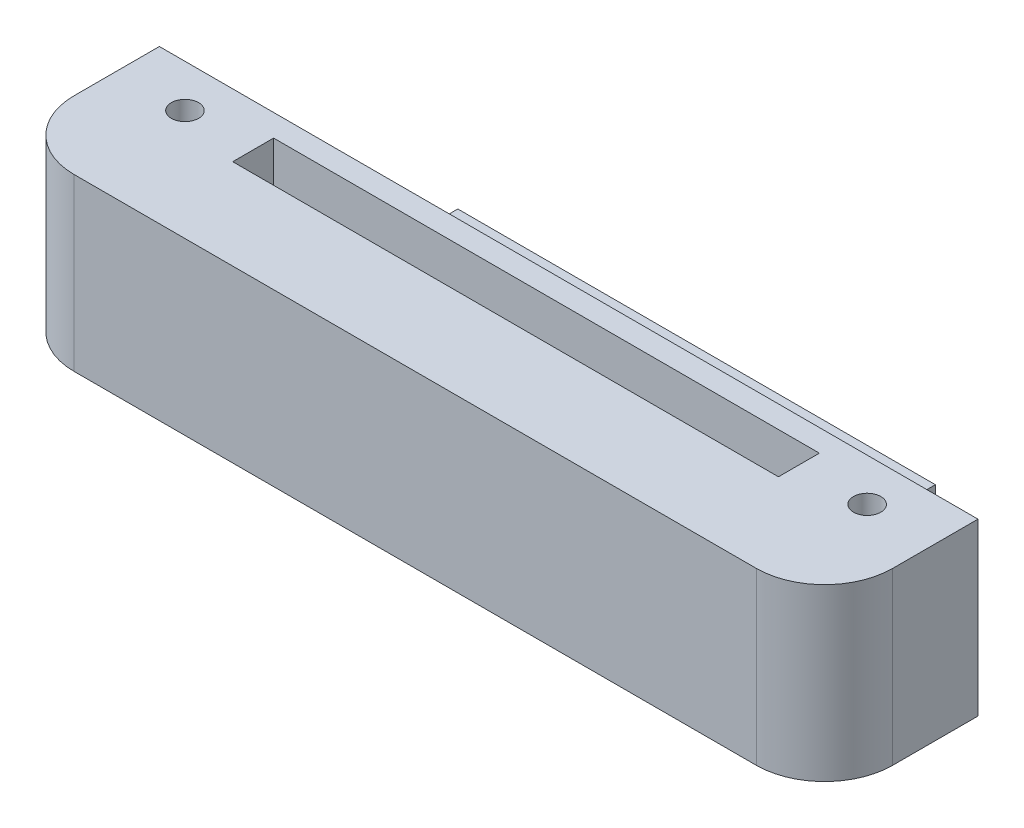
ISO-10303-21;
HEADER;
FILE_DESCRIPTION(('STEP AP214'),'2;1');
FILE_NAME('part.step','',(''),(''),'','','');
FILE_SCHEMA(('AUTOMOTIVE_DESIGN { 1 0 10303 214 1 1 1 1 }'));
ENDSEC;
DATA;
#1=APPLICATION_CONTEXT('core data for automotive mechanical design processes');
#2=APPLICATION_PROTOCOL_DEFINITION('international standard','automotive_design',2000,#1);
#3=PRODUCT_CONTEXT('',#1,'mechanical');
#4=PRODUCT('Part','Part','',(#3));
#5=PRODUCT_RELATED_PRODUCT_CATEGORY('part','',(#4));
#6=PRODUCT_DEFINITION_FORMATION('','',#4);
#7=PRODUCT_DEFINITION_CONTEXT('part definition',#1,'design');
#8=PRODUCT_DEFINITION('design','',#6,#7);
#9=PRODUCT_DEFINITION_SHAPE('','',#8);
#10=(LENGTH_UNIT() NAMED_UNIT(*) SI_UNIT(.MILLI.,.METRE.));
#11=(NAMED_UNIT(*) PLANE_ANGLE_UNIT() SI_UNIT($,.RADIAN.));
#12=(NAMED_UNIT(*) SI_UNIT($,.STERADIAN.) SOLID_ANGLE_UNIT());
#13=UNCERTAINTY_MEASURE_WITH_UNIT(LENGTH_MEASURE(1.E-05),#10,'distance_accuracy_value','');
#14=(GEOMETRIC_REPRESENTATION_CONTEXT(3) GLOBAL_UNCERTAINTY_ASSIGNED_CONTEXT((#13)) GLOBAL_UNIT_ASSIGNED_CONTEXT((#10,
#11,#12)) REPRESENTATION_CONTEXT('',''));
#15=CARTESIAN_POINT('',(0.,0.,0.));
#16=DIRECTION('',(0.,0.,1.));
#17=DIRECTION('',(1.,0.,0.));
#18=AXIS2_PLACEMENT_3D('',#15,#16,#17);
#19=CARTESIAN_POINT('',(60.,25.,15.625));
#20=DIRECTION('',(-1.,0.,0.));
#21=DIRECTION('',(0.,0.,1.));
#22=AXIS2_PLACEMENT_3D('',#19,#20,#21);
#23=PLANE('',#22);
#24=DIRECTION('',(0.,0.,-1.));
#25=VECTOR('',#24,1.);
#26=CARTESIAN_POINT('',(60.,0.,15.625));
#27=LINE('',#26,#25);
#28=CARTESIAN_POINT('',(60.,0.,15.625));
#29=VERTEX_POINT('',#28);
#30=CARTESIAN_POINT('',(60.,0.,3.12499999999999));
#31=VERTEX_POINT('',#30);
#32=EDGE_CURVE('E160',#29,#31,#27,.T.);
#33=ORIENTED_EDGE('',*,*,#32,.T.);
#34=DIRECTION('',(0.,-1.,0.));
#35=VECTOR('',#34,1.);
#36=CARTESIAN_POINT('',(60.,25.,3.125));
#37=LINE('',#36,#35);
#38=CARTESIAN_POINT('',(60.,25.,3.125));
#39=VERTEX_POINT('',#38);
#40=EDGE_CURVE('E218',#39,#31,#37,.T.);
#41=ORIENTED_EDGE('',*,*,#40,.F.);
#42=DIRECTION('',(0.,0.,-1.));
#43=VECTOR('',#42,1.);
#44=CARTESIAN_POINT('',(60.,25.,15.625));
#45=LINE('',#44,#43);
#46=CARTESIAN_POINT('',(60.,25.,15.625));
#47=VERTEX_POINT('',#46);
#48=EDGE_CURVE('E167',#47,#39,#45,.T.);
#49=ORIENTED_EDGE('',*,*,#48,.F.);
#50=DIRECTION('',(0.,1.,0.));
#51=VECTOR('',#50,1.);
#52=CARTESIAN_POINT('',(60.,25.,15.625));
#53=LINE('',#52,#51);
#54=EDGE_CURVE('E188',#47,#29,#53,.F.);
#55=ORIENTED_EDGE('',*,*,#54,.T.);
#56=EDGE_LOOP('',(#33,#41,#49,#55));
#57=FACE_BOUND('',#56,.T.);
#58=ADVANCED_FACE('F35',(#57),#23,.F.);
#59=CARTESIAN_POINT('',(-60.,25.,-15.625));
#60=DIRECTION('',(0.,0.,1.));
#61=DIRECTION('',(1.,0.,0.));
#62=AXIS2_PLACEMENT_3D('',#59,#60,#61);
#63=PLANE('',#62);
#64=DIRECTION('',(-1.,0.,0.));
#65=VECTOR('',#64,1.);
#66=CARTESIAN_POINT('',(-60.,0.,-15.625));
#67=LINE('',#66,#65);
#68=CARTESIAN_POINT('',(35.,0.,-15.625));
#69=VERTEX_POINT('',#68);
#70=CARTESIAN_POINT('',(-35.,0.,-15.625));
#71=VERTEX_POINT('',#70);
#72=EDGE_CURVE('E175',#69,#71,#67,.T.);
#73=ORIENTED_EDGE('',*,*,#72,.T.);
#74=DIRECTION('',(0.,1.,0.));
#75=VECTOR('',#74,1.);
#76=CARTESIAN_POINT('',(-35.,-17.5,-15.625));
#77=LINE('',#76,#75);
#78=CARTESIAN_POINT('',(-35.,7.5,-15.625));
#79=VERTEX_POINT('',#78);
#80=EDGE_CURVE('E146',#71,#79,#77,.T.);
#81=ORIENTED_EDGE('',*,*,#80,.T.);
#82=DIRECTION('',(1.,0.,0.));
#83=VECTOR('',#82,1.);
#84=CARTESIAN_POINT('',(-60.,7.5,-15.625));
#85=LINE('',#84,#83);
#86=CARTESIAN_POINT('',(35.,7.5,-15.625));
#87=VERTEX_POINT('',#86);
#88=EDGE_CURVE('E154',#79,#87,#85,.T.);
#89=ORIENTED_EDGE('',*,*,#88,.T.);
#90=DIRECTION('',(0.,1.,0.));
#91=VECTOR('',#90,1.);
#92=CARTESIAN_POINT('',(35.,-17.5,-15.625));
#93=LINE('',#92,#91);
#94=EDGE_CURVE('E272',#69,#87,#93,.T.);
#95=ORIENTED_EDGE('',*,*,#94,.F.);
#96=EDGE_LOOP('',(#73,#81,#89,#95));
#97=FACE_BOUND('',#96,.T.);
#98=ADVANCED_FACE('F277',(#97),#63,.F.);
#99=CARTESIAN_POINT('',(-60.,25.,15.625));
#100=DIRECTION('',(1.,0.,0.));
#101=DIRECTION('',(0.,0.,-1.));
#102=AXIS2_PLACEMENT_3D('',#99,#100,#101);
#103=PLANE('',#102);
#104=DIRECTION('',(0.,-1.,0.));
#105=VECTOR('',#104,1.);
#106=CARTESIAN_POINT('',(-60.,25.,3.125));
#107=LINE('',#106,#105);
#108=CARTESIAN_POINT('',(-60.,25.,3.125));
#109=VERTEX_POINT('',#108);
#110=CARTESIAN_POINT('',(-60.,0.,3.12499999999999));
#111=VERTEX_POINT('',#110);
#112=EDGE_CURVE('E163',#109,#111,#107,.T.);
#113=ORIENTED_EDGE('',*,*,#112,.T.);
#114=DIRECTION('',(0.,0.,1.));
#115=VECTOR('',#114,1.);
#116=CARTESIAN_POINT('',(-60.,0.,15.625));
#117=LINE('',#116,#115);
#118=CARTESIAN_POINT('',(-60.,0.,15.625));
#119=VERTEX_POINT('',#118);
#120=EDGE_CURVE('E57',#111,#119,#117,.T.);
#121=ORIENTED_EDGE('',*,*,#120,.T.);
#122=DIRECTION('',(0.,-1.,0.));
#123=VECTOR('',#122,1.);
#124=CARTESIAN_POINT('',(-60.,25.,15.625));
#125=LINE('',#124,#123);
#126=CARTESIAN_POINT('',(-60.,25.,15.625));
#127=VERTEX_POINT('',#126);
#128=EDGE_CURVE('E11',#119,#127,#125,.F.);
#129=ORIENTED_EDGE('',*,*,#128,.T.);
#130=DIRECTION('',(0.,0.,1.));
#131=VECTOR('',#130,1.);
#132=CARTESIAN_POINT('',(-60.,25.,15.625));
#133=LINE('',#132,#131);
#134=EDGE_CURVE('E169',#109,#127,#133,.T.);
#135=ORIENTED_EDGE('',*,*,#134,.F.);
#136=EDGE_LOOP('',(#113,#121,#129,#135));
#137=FACE_BOUND('',#136,.T.);
#138=ADVANCED_FACE('F283',(#137),#103,.F.);
#139=CARTESIAN_POINT('',(0.,25.,0.));
#140=DIRECTION('',(0.,-1.,0.));
#141=DIRECTION('',(0.,0.,-1.));
#142=AXIS2_PLACEMENT_3D('',#139,#140,#141);
#143=PLANE('',#142);
#144=DIRECTION('',(-1.,0.,0.));
#145=VECTOR('',#144,1.);
#146=CARTESIAN_POINT('',(-40.,25.,6.375));
#147=LINE('',#146,#145);
#148=CARTESIAN_POINT('',(40.,25.,6.375));
#149=VERTEX_POINT('',#148);
#150=CARTESIAN_POINT('',(-40.,25.,6.375));
#151=VERTEX_POINT('',#150);
#152=EDGE_CURVE('E250',#149,#151,#147,.T.);
#153=ORIENTED_EDGE('',*,*,#152,.F.);
#154=DIRECTION('',(0.,0.,-1.));
#155=VECTOR('',#154,1.);
#156=CARTESIAN_POINT('',(40.,25.,12.375));
#157=LINE('',#156,#155);
#158=CARTESIAN_POINT('',(40.,25.,12.375));
#159=VERTEX_POINT('',#158);
#160=EDGE_CURVE('E253',#159,#149,#157,.T.);
#161=ORIENTED_EDGE('',*,*,#160,.F.);
#162=DIRECTION('',(1.,0.,0.));
#163=VECTOR('',#162,1.);
#164=CARTESIAN_POINT('',(-40.,25.,12.375));
#165=LINE('',#164,#163);
#166=CARTESIAN_POINT('',(-40.,25.,12.375));
#167=VERTEX_POINT('',#166);
#168=EDGE_CURVE('E243',#167,#159,#165,.T.);
#169=ORIENTED_EDGE('',*,*,#168,.F.);
#170=DIRECTION('',(0.,0.,1.));
#171=VECTOR('',#170,1.);
#172=CARTESIAN_POINT('',(-40.,25.,12.375));
#173=LINE('',#172,#171);
#174=EDGE_CURVE('E247',#151,#167,#173,.T.);
#175=ORIENTED_EDGE('',*,*,#174,.F.);
#176=EDGE_LOOP('',(#153,#161,#169,#175));
#177=FACE_BOUND('',#176,.T.);
#178=CARTESIAN_POINT('',(50.,25.,9.37499999999999));
#179=DIRECTION('',(0.,1.,0.));
#180=DIRECTION('',(0.,0.,1.));
#181=AXIS2_PLACEMENT_3D('',#178,#179,#180);
#182=CIRCLE('',#181,1.99999999999999);
#183=CARTESIAN_POINT('',(50.,25.,11.375));
#184=VERTEX_POINT('',#183);
#185=EDGE_CURVE('E230',#184,#184,#182,.T.);
#186=ORIENTED_EDGE('',*,*,#185,.F.);
#187=EDGE_LOOP('',(#186));
#188=FACE_BOUND('',#187,.T.);
#189=CARTESIAN_POINT('',(-50.,25.,9.375));
#190=DIRECTION('',(0.,1.,0.));
#191=DIRECTION('',(0.,0.,1.));
#192=AXIS2_PLACEMENT_3D('',#189,#190,#191);
#193=CIRCLE('',#192,1.99999999999999);
#194=CARTESIAN_POINT('',(-50.,25.,11.375));
#195=VERTEX_POINT('',#194);
#196=EDGE_CURVE('E222',#195,#195,#193,.T.);
#197=ORIENTED_EDGE('',*,*,#196,.F.);
#198=EDGE_LOOP('',(#197));
#199=FACE_BOUND('',#198,.T.);
#200=DIRECTION('',(-1.,0.,0.));
#201=VECTOR('',#200,1.);
#202=CARTESIAN_POINT('',(-60.,25.,25.625));
#203=LINE('',#202,#201);
#204=CARTESIAN_POINT('',(50.,25.,25.625));
#205=VERTEX_POINT('',#204);
#206=CARTESIAN_POINT('',(-50.,25.,25.625));
#207=VERTEX_POINT('',#206);
#208=EDGE_CURVE('E208',#205,#207,#203,.T.);
#209=ORIENTED_EDGE('',*,*,#208,.F.);
#210=CARTESIAN_POINT('',(50.,25.,15.625));
#211=DIRECTION('',(0.,-1.,0.));
#212=DIRECTION('',(0.,0.,-1.));
#213=AXIS2_PLACEMENT_3D('',#210,#211,#212);
#214=CIRCLE('',#213,10.);
#215=EDGE_CURVE('E186',#205,#47,#214,.F.);
#216=ORIENTED_EDGE('',*,*,#215,.T.);
#217=ORIENTED_EDGE('',*,*,#48,.T.);
#218=DIRECTION('',(1.,0.,0.));
#219=VECTOR('',#218,1.);
#220=CARTESIAN_POINT('',(-60.,25.,3.125));
#221=LINE('',#220,#219);
#222=EDGE_CURVE('E158',#109,#39,#221,.T.);
#223=ORIENTED_EDGE('',*,*,#222,.F.);
#224=ORIENTED_EDGE('',*,*,#134,.T.);
#225=CARTESIAN_POINT('',(-50.,25.,15.625));
#226=DIRECTION('',(0.,-1.,0.));
#227=DIRECTION('',(0.,0.,-1.));
#228=AXIS2_PLACEMENT_3D('',#225,#226,#227);
#229=CIRCLE('',#228,10.);
#230=EDGE_CURVE('E184',#127,#207,#229,.F.);
#231=ORIENTED_EDGE('',*,*,#230,.T.);
#232=EDGE_LOOP('',(#209,#216,#217,#223,#224,#231));
#233=FACE_BOUND('',#232,.T.);
#234=ADVANCED_FACE('F214',(#177,#188,#199,#233),#143,.F.);
#235=CARTESIAN_POINT('',(0.,0.,0.));
#236=DIRECTION('',(0.,-1.,0.));
#237=DIRECTION('',(0.,0.,-1.));
#238=AXIS2_PLACEMENT_3D('',#235,#236,#237);
#239=PLANE('',#238);
#240=DIRECTION('',(0.,0.,1.));
#241=VECTOR('',#240,1.);
#242=CARTESIAN_POINT('',(-35.,0.,0.));
#243=LINE('',#242,#241);
#244=CARTESIAN_POINT('',(-35.,0.,3.12499999999999));
#245=VERTEX_POINT('',#244);
#246=EDGE_CURVE('E141',#71,#245,#243,.T.);
#247=ORIENTED_EDGE('',*,*,#246,.F.);
#248=ORIENTED_EDGE('',*,*,#72,.F.);
#249=DIRECTION('',(0.,0.,-1.));
#250=VECTOR('',#249,1.);
#251=CARTESIAN_POINT('',(35.,0.,0.));
#252=LINE('',#251,#250);
#253=CARTESIAN_POINT('',(35.,0.,3.12499999999999));
#254=VERTEX_POINT('',#253);
#255=EDGE_CURVE('E270',#254,#69,#252,.T.);
#256=ORIENTED_EDGE('',*,*,#255,.F.);
#257=DIRECTION('',(-1.,0.,0.));
#258=VECTOR('',#257,1.);
#259=CARTESIAN_POINT('',(0.,0.,3.12499999999999));
#260=LINE('',#259,#258);
#261=EDGE_CURVE('E268',#31,#254,#260,.T.);
#262=ORIENTED_EDGE('',*,*,#261,.F.);
#263=ORIENTED_EDGE('',*,*,#32,.F.);
#264=CARTESIAN_POINT('',(50.,0.,15.625));
#265=DIRECTION('',(0.,-1.,0.));
#266=DIRECTION('',(0.,0.,-1.));
#267=AXIS2_PLACEMENT_3D('',#264,#265,#266);
#268=CIRCLE('',#267,10.);
#269=CARTESIAN_POINT('',(50.,0.,25.625));
#270=VERTEX_POINT('',#269);
#271=EDGE_CURVE('E43',#29,#270,#268,.T.);
#272=ORIENTED_EDGE('',*,*,#271,.T.);
#273=DIRECTION('',(1.,0.,0.));
#274=VECTOR('',#273,1.);
#275=CARTESIAN_POINT('',(-60.,0.,25.625));
#276=LINE('',#275,#274);
#277=CARTESIAN_POINT('',(-50.,0.,25.625));
#278=VERTEX_POINT('',#277);
#279=EDGE_CURVE('E198',#278,#270,#276,.T.);
#280=ORIENTED_EDGE('',*,*,#279,.F.);
#281=CARTESIAN_POINT('',(-50.,0.,15.625));
#282=DIRECTION('',(0.,-1.,0.));
#283=DIRECTION('',(0.,0.,-1.));
#284=AXIS2_PLACEMENT_3D('',#281,#282,#283);
#285=CIRCLE('',#284,10.);
#286=EDGE_CURVE('E190',#278,#119,#285,.T.);
#287=ORIENTED_EDGE('',*,*,#286,.T.);
#288=ORIENTED_EDGE('',*,*,#120,.F.);
#289=DIRECTION('',(-1.,0.,0.));
#290=VECTOR('',#289,1.);
#291=CARTESIAN_POINT('',(0.,0.,3.12499999999999));
#292=LINE('',#291,#290);
#293=EDGE_CURVE('E266',#245,#111,#292,.T.);
#294=ORIENTED_EDGE('',*,*,#293,.F.);
#295=EDGE_LOOP('',(#247,#248,#256,#262,#263,#272,#280,#287,#288,#294));
#296=FACE_BOUND('',#295,.T.);
#297=CARTESIAN_POINT('',(50.,0.,9.37499999999999));
#298=DIRECTION('',(0.,1.,0.));
#299=DIRECTION('',(0.,0.,1.));
#300=AXIS2_PLACEMENT_3D('',#297,#298,#299);
#301=CIRCLE('',#300,1.99999999999999);
#302=CARTESIAN_POINT('',(50.,0.,11.375));
#303=VERTEX_POINT('',#302);
#304=EDGE_CURVE('E227',#303,#303,#301,.T.);
#305=ORIENTED_EDGE('',*,*,#304,.T.);
#306=EDGE_LOOP('',(#305));
#307=FACE_BOUND('',#306,.T.);
#308=CARTESIAN_POINT('',(-50.,0.,9.375));
#309=DIRECTION('',(0.,1.,0.));
#310=DIRECTION('',(0.,0.,1.));
#311=AXIS2_PLACEMENT_3D('',#308,#309,#310);
#312=CIRCLE('',#311,1.99999999999999);
#313=CARTESIAN_POINT('',(-50.,0.,11.375));
#314=VERTEX_POINT('',#313);
#315=EDGE_CURVE('E219',#314,#314,#312,.T.);
#316=ORIENTED_EDGE('',*,*,#315,.T.);
#317=EDGE_LOOP('',(#316));
#318=FACE_BOUND('',#317,.T.);
#319=ADVANCED_FACE('F196',(#296,#307,#318),#239,.T.);
#320=CARTESIAN_POINT('',(-60.,7.5,-15.625));
#321=DIRECTION('',(0.,-1.,0.));
#322=DIRECTION('',(0.,0.,-1.));
#323=AXIS2_PLACEMENT_3D('',#320,#321,#322);
#324=PLANE('',#323);
#325=ORIENTED_EDGE('',*,*,#88,.F.);
#326=DIRECTION('',(0.,0.,-1.));
#327=VECTOR('',#326,1.);
#328=CARTESIAN_POINT('',(-35.,7.5,-15.625));
#329=LINE('',#328,#327);
#330=CARTESIAN_POINT('',(-35.,7.5,3.125));
#331=VERTEX_POINT('',#330);
#332=EDGE_CURVE('E138',#331,#79,#329,.T.);
#333=ORIENTED_EDGE('',*,*,#332,.F.);
#334=DIRECTION('',(1.,0.,0.));
#335=VECTOR('',#334,1.);
#336=CARTESIAN_POINT('',(-60.,7.5,3.125));
#337=LINE('',#336,#335);
#338=CARTESIAN_POINT('',(35.,7.5,3.125));
#339=VERTEX_POINT('',#338);
#340=EDGE_CURVE('E152',#331,#339,#337,.T.);
#341=ORIENTED_EDGE('',*,*,#340,.T.);
#342=DIRECTION('',(0.,0.,1.));
#343=VECTOR('',#342,1.);
#344=CARTESIAN_POINT('',(35.,7.5,-15.625));
#345=LINE('',#344,#343);
#346=EDGE_CURVE('E50',#87,#339,#345,.T.);
#347=ORIENTED_EDGE('',*,*,#346,.F.);
#348=EDGE_LOOP('',(#325,#333,#341,#347));
#349=FACE_BOUND('',#348,.T.);
#350=ADVANCED_FACE('F151',(#349),#324,.F.);
#351=CARTESIAN_POINT('',(-60.,25.,3.125));
#352=DIRECTION('',(0.,0.,1.));
#353=DIRECTION('',(0.,-1.,0.));
#354=AXIS2_PLACEMENT_3D('',#351,#352,#353);
#355=PLANE('',#354);
#356=ORIENTED_EDGE('',*,*,#40,.T.);
#357=ORIENTED_EDGE('',*,*,#261,.T.);
#358=DIRECTION('',(0.,1.,0.));
#359=VECTOR('',#358,1.);
#360=CARTESIAN_POINT('',(35.,-17.5,3.12499999999999));
#361=LINE('',#360,#359);
#362=EDGE_CURVE('E155',#254,#339,#361,.T.);
#363=ORIENTED_EDGE('',*,*,#362,.T.);
#364=ORIENTED_EDGE('',*,*,#340,.F.);
#365=DIRECTION('',(0.,1.,0.));
#366=VECTOR('',#365,1.);
#367=CARTESIAN_POINT('',(-35.,-17.5,3.12499999999999));
#368=LINE('',#367,#366);
#369=EDGE_CURVE('E135',#245,#331,#368,.T.);
#370=ORIENTED_EDGE('',*,*,#369,.F.);
#371=ORIENTED_EDGE('',*,*,#293,.T.);
#372=ORIENTED_EDGE('',*,*,#112,.F.);
#373=ORIENTED_EDGE('',*,*,#222,.T.);
#374=EDGE_LOOP('',(#356,#357,#363,#364,#370,#371,#372,#373));
#375=FACE_BOUND('',#374,.T.);
#376=ADVANCED_FACE('F157',(#375),#355,.F.);
#377=CARTESIAN_POINT('',(-50.,25.,9.375));
#378=DIRECTION('',(0.,1.,0.));
#379=DIRECTION('',(0.,0.,1.));
#380=AXIS2_PLACEMENT_3D('',#377,#378,#379);
#381=CYLINDRICAL_SURFACE('',#380,1.99999999999999);
#382=ORIENTED_EDGE('',*,*,#315,.F.);
#383=EDGE_LOOP('',(#382));
#384=FACE_BOUND('',#383,.T.);
#385=ORIENTED_EDGE('',*,*,#196,.T.);
#386=EDGE_LOOP('',(#385));
#387=FACE_BOUND('',#386,.T.);
#388=ADVANCED_FACE('F310',(#384,#387),#381,.F.);
#389=CARTESIAN_POINT('',(50.,25.,9.37499999999999));
#390=DIRECTION('',(0.,1.,0.));
#391=DIRECTION('',(0.,0.,1.));
#392=AXIS2_PLACEMENT_3D('',#389,#390,#391);
#393=CYLINDRICAL_SURFACE('',#392,1.99999999999999);
#394=ORIENTED_EDGE('',*,*,#304,.F.);
#395=EDGE_LOOP('',(#394));
#396=FACE_BOUND('',#395,.T.);
#397=ORIENTED_EDGE('',*,*,#185,.T.);
#398=EDGE_LOOP('',(#397));
#399=FACE_BOUND('',#398,.T.);
#400=ADVANCED_FACE('F315',(#396,#399),#393,.F.);
#401=CARTESIAN_POINT('',(0.,0.,25.625));
#402=DIRECTION('',(0.,0.,-1.));
#403=DIRECTION('',(-1.,0.,0.));
#404=AXIS2_PLACEMENT_3D('',#401,#402,#403);
#405=PLANE('',#404);
#406=ORIENTED_EDGE('',*,*,#279,.T.);
#407=DIRECTION('',(0.,1.,0.));
#408=VECTOR('',#407,1.);
#409=CARTESIAN_POINT('',(50.,0.,25.625));
#410=LINE('',#409,#408);
#411=EDGE_CURVE('E181',#270,#205,#410,.T.);
#412=ORIENTED_EDGE('',*,*,#411,.T.);
#413=ORIENTED_EDGE('',*,*,#208,.T.);
#414=DIRECTION('',(0.,-1.,0.));
#415=VECTOR('',#414,1.);
#416=CARTESIAN_POINT('',(-50.,0.,25.625));
#417=LINE('',#416,#415);
#418=EDGE_CURVE('E172',#207,#278,#417,.T.);
#419=ORIENTED_EDGE('',*,*,#418,.T.);
#420=EDGE_LOOP('',(#406,#412,#413,#419));
#421=FACE_BOUND('',#420,.T.);
#422=ADVANCED_FACE('F204',(#421),#405,.F.);
#423=CARTESIAN_POINT('',(40.,7.5,12.375));
#424=DIRECTION('',(1.,0.,0.));
#425=DIRECTION('',(0.,0.,-1.));
#426=AXIS2_PLACEMENT_3D('',#423,#424,#425);
#427=PLANE('',#426);
#428=ORIENTED_EDGE('',*,*,#160,.T.);
#429=DIRECTION('',(0.,1.,0.));
#430=VECTOR('',#429,1.);
#431=CARTESIAN_POINT('',(40.,7.5,6.375));
#432=LINE('',#431,#430);
#433=CARTESIAN_POINT('',(40.,7.5,6.375));
#434=VERTEX_POINT('',#433);
#435=EDGE_CURVE('E234',#434,#149,#432,.T.);
#436=ORIENTED_EDGE('',*,*,#435,.F.);
#437=DIRECTION('',(0.,0.,-1.));
#438=VECTOR('',#437,1.);
#439=CARTESIAN_POINT('',(40.,7.5,12.375));
#440=LINE('',#439,#438);
#441=CARTESIAN_POINT('',(40.,7.5,12.375));
#442=VERTEX_POINT('',#441);
#443=EDGE_CURVE('E246',#442,#434,#440,.T.);
#444=ORIENTED_EDGE('',*,*,#443,.F.);
#445=DIRECTION('',(0.,1.,0.));
#446=VECTOR('',#445,1.);
#447=CARTESIAN_POINT('',(40.,7.5,12.375));
#448=LINE('',#447,#446);
#449=EDGE_CURVE('E209',#442,#159,#448,.T.);
#450=ORIENTED_EDGE('',*,*,#449,.T.);
#451=EDGE_LOOP('',(#428,#436,#444,#450));
#452=FACE_BOUND('',#451,.T.);
#453=ADVANCED_FACE('F322',(#452),#427,.F.);
#454=CARTESIAN_POINT('',(-40.,7.5,12.375));
#455=DIRECTION('',(0.,0.,1.));
#456=DIRECTION('',(1.,0.,0.));
#457=AXIS2_PLACEMENT_3D('',#454,#455,#456);
#458=PLANE('',#457);
#459=ORIENTED_EDGE('',*,*,#168,.T.);
#460=ORIENTED_EDGE('',*,*,#449,.F.);
#461=DIRECTION('',(1.,0.,0.));
#462=VECTOR('',#461,1.);
#463=CARTESIAN_POINT('',(-40.,7.5,12.375));
#464=LINE('',#463,#462);
#465=CARTESIAN_POINT('',(-40.,7.5,12.375));
#466=VERTEX_POINT('',#465);
#467=EDGE_CURVE('E238',#466,#442,#464,.T.);
#468=ORIENTED_EDGE('',*,*,#467,.F.);
#469=DIRECTION('',(0.,1.,0.));
#470=VECTOR('',#469,1.);
#471=CARTESIAN_POINT('',(-40.,7.5,12.375));
#472=LINE('',#471,#470);
#473=EDGE_CURVE('E240',#466,#167,#472,.T.);
#474=ORIENTED_EDGE('',*,*,#473,.T.);
#475=EDGE_LOOP('',(#459,#460,#468,#474));
#476=FACE_BOUND('',#475,.T.);
#477=ADVANCED_FACE('F325',(#476),#458,.F.);
#478=CARTESIAN_POINT('',(-40.,7.5,12.375));
#479=DIRECTION('',(-1.,0.,0.));
#480=DIRECTION('',(0.,0.,1.));
#481=AXIS2_PLACEMENT_3D('',#478,#479,#480);
#482=PLANE('',#481);
#483=ORIENTED_EDGE('',*,*,#174,.T.);
#484=ORIENTED_EDGE('',*,*,#473,.F.);
#485=DIRECTION('',(0.,0.,1.));
#486=VECTOR('',#485,1.);
#487=CARTESIAN_POINT('',(-40.,7.5,12.375));
#488=LINE('',#487,#486);
#489=CARTESIAN_POINT('',(-40.,7.5,6.375));
#490=VERTEX_POINT('',#489);
#491=EDGE_CURVE('E257',#490,#466,#488,.T.);
#492=ORIENTED_EDGE('',*,*,#491,.F.);
#493=DIRECTION('',(0.,1.,0.));
#494=VECTOR('',#493,1.);
#495=CARTESIAN_POINT('',(-40.,7.5,6.375));
#496=LINE('',#495,#494);
#497=EDGE_CURVE('E237',#490,#151,#496,.T.);
#498=ORIENTED_EDGE('',*,*,#497,.T.);
#499=EDGE_LOOP('',(#483,#484,#492,#498));
#500=FACE_BOUND('',#499,.T.);
#501=ADVANCED_FACE('F330',(#500),#482,.F.);
#502=CARTESIAN_POINT('',(-40.,7.5,6.375));
#503=DIRECTION('',(0.,0.,-1.));
#504=DIRECTION('',(-1.,0.,0.));
#505=AXIS2_PLACEMENT_3D('',#502,#503,#504);
#506=PLANE('',#505);
#507=ORIENTED_EDGE('',*,*,#152,.T.);
#508=ORIENTED_EDGE('',*,*,#497,.F.);
#509=DIRECTION('',(-1.,0.,0.));
#510=VECTOR('',#509,1.);
#511=CARTESIAN_POINT('',(-40.,7.5,6.375));
#512=LINE('',#511,#510);
#513=EDGE_CURVE('E260',#434,#490,#512,.T.);
#514=ORIENTED_EDGE('',*,*,#513,.F.);
#515=ORIENTED_EDGE('',*,*,#435,.T.);
#516=EDGE_LOOP('',(#507,#508,#514,#515));
#517=FACE_BOUND('',#516,.T.);
#518=ADVANCED_FACE('F327',(#517),#506,.F.);
#519=CARTESIAN_POINT('',(0.,7.5,0.));
#520=DIRECTION('',(0.,-1.,0.));
#521=DIRECTION('',(0.,0.,-1.));
#522=AXIS2_PLACEMENT_3D('',#519,#520,#521);
#523=PLANE('',#522);
#524=ORIENTED_EDGE('',*,*,#443,.T.);
#525=ORIENTED_EDGE('',*,*,#513,.T.);
#526=ORIENTED_EDGE('',*,*,#491,.T.);
#527=ORIENTED_EDGE('',*,*,#467,.T.);
#528=EDGE_LOOP('',(#524,#525,#526,#527));
#529=FACE_BOUND('',#528,.T.);
#530=ADVANCED_FACE('F293',(#529),#523,.F.);
#531=CARTESIAN_POINT('',(50.,0.,15.625));
#532=DIRECTION('',(0.,1.,0.));
#533=DIRECTION('',(0.,0.,1.));
#534=AXIS2_PLACEMENT_3D('',#531,#532,#533);
#535=CYLINDRICAL_SURFACE('',#534,10.);
#536=ORIENTED_EDGE('',*,*,#271,.F.);
#537=ORIENTED_EDGE('',*,*,#54,.F.);
#538=ORIENTED_EDGE('',*,*,#215,.F.);
#539=ORIENTED_EDGE('',*,*,#411,.F.);
#540=EDGE_LOOP('',(#536,#537,#538,#539));
#541=FACE_BOUND('',#540,.T.);
#542=ADVANCED_FACE('F211',(#541),#535,.T.);
#543=CARTESIAN_POINT('',(-50.,0.,15.625));
#544=DIRECTION('',(0.,-1.,0.));
#545=DIRECTION('',(0.,0.,-1.));
#546=AXIS2_PLACEMENT_3D('',#543,#544,#545);
#547=CYLINDRICAL_SURFACE('',#546,10.);
#548=ORIENTED_EDGE('',*,*,#230,.F.);
#549=ORIENTED_EDGE('',*,*,#128,.F.);
#550=ORIENTED_EDGE('',*,*,#286,.F.);
#551=ORIENTED_EDGE('',*,*,#418,.F.);
#552=EDGE_LOOP('',(#548,#549,#550,#551));
#553=FACE_BOUND('',#552,.T.);
#554=ADVANCED_FACE('F37',(#553),#547,.T.);
#555=CARTESIAN_POINT('',(35.,-17.5,-15.625));
#556=DIRECTION('',(-1.,0.,0.));
#557=DIRECTION('',(0.,0.,1.));
#558=AXIS2_PLACEMENT_3D('',#555,#556,#557);
#559=PLANE('',#558);
#560=ORIENTED_EDGE('',*,*,#255,.T.);
#561=ORIENTED_EDGE('',*,*,#94,.T.);
#562=ORIENTED_EDGE('',*,*,#346,.T.);
#563=ORIENTED_EDGE('',*,*,#362,.F.);
#564=EDGE_LOOP('',(#560,#561,#562,#563));
#565=FACE_BOUND('',#564,.T.);
#566=ADVANCED_FACE('F287',(#565),#559,.F.);
#567=CARTESIAN_POINT('',(-35.,-17.5,-15.625));
#568=DIRECTION('',(1.,0.,0.));
#569=DIRECTION('',(0.,0.,-1.));
#570=AXIS2_PLACEMENT_3D('',#567,#568,#569);
#571=PLANE('',#570);
#572=ORIENTED_EDGE('',*,*,#246,.T.);
#573=ORIENTED_EDGE('',*,*,#369,.T.);
#574=ORIENTED_EDGE('',*,*,#332,.T.);
#575=ORIENTED_EDGE('',*,*,#80,.F.);
#576=EDGE_LOOP('',(#572,#573,#574,#575));
#577=FACE_BOUND('',#576,.T.);
#578=ADVANCED_FACE('F137',(#577),#571,.F.);
#579=CLOSED_SHELL('',(#58,#98,#138,#234,#319,#350,#376,#388,#400,#422,#453,#477,#501,#518,#530,
#542,#554,#566,#578));
#580=MANIFOLD_SOLID_BREP('B2',#579);
#581=ADVANCED_BREP_SHAPE_REPRESENTATION('',(#18,#580),#14);
#582=SHAPE_DEFINITION_REPRESENTATION(#9,#581);
ENDSEC;
END-ISO-10303-21;
